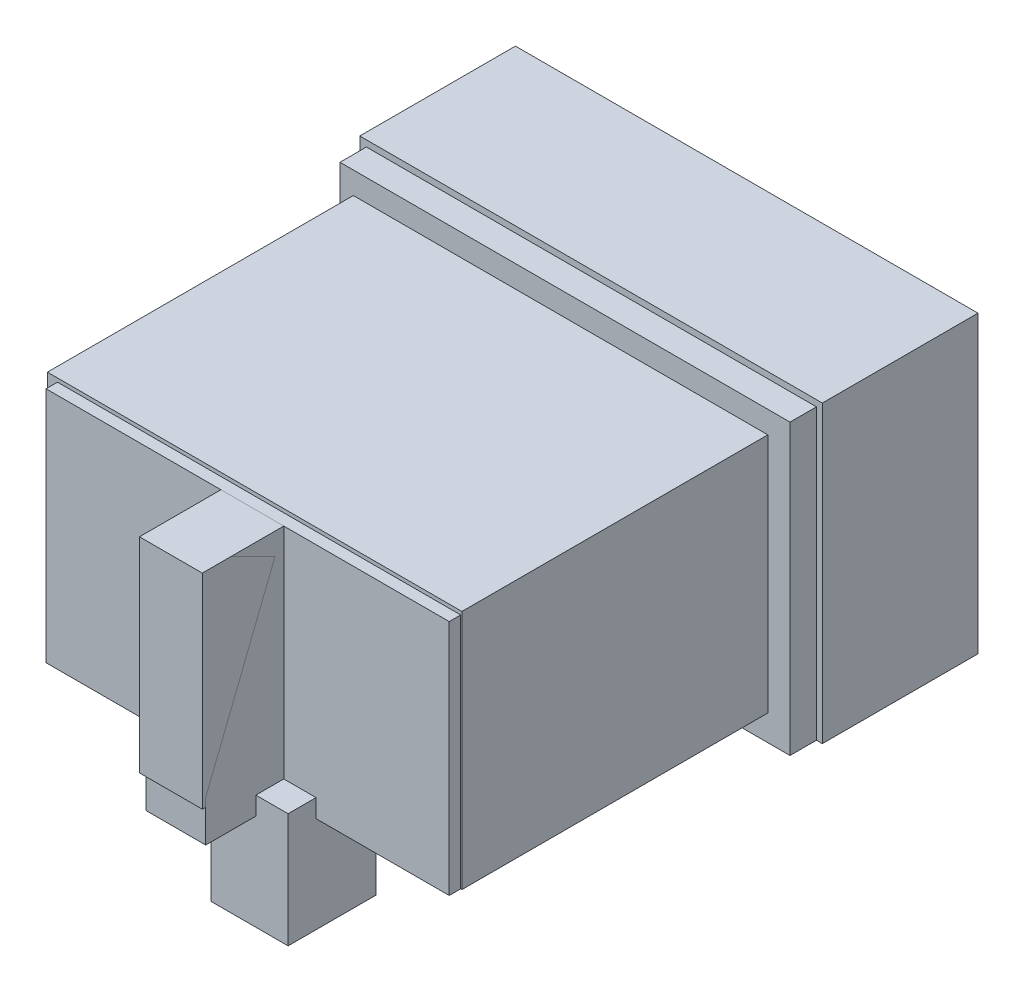
ISO-10303-21;
HEADER;
FILE_DESCRIPTION(('STEP AP214'),'2;1');
FILE_NAME('part.step','',(''),(''),'','','');
FILE_SCHEMA(('AUTOMOTIVE_DESIGN { 1 0 10303 214 1 1 1 1 }'));
ENDSEC;
DATA;
#1=APPLICATION_CONTEXT('core data for automotive mechanical design processes');
#2=APPLICATION_PROTOCOL_DEFINITION('international standard','automotive_design',2000,#1);
#3=PRODUCT_CONTEXT('',#1,'mechanical');
#4=PRODUCT('Part','Part','',(#3));
#5=PRODUCT_RELATED_PRODUCT_CATEGORY('part','',(#4));
#6=PRODUCT_DEFINITION_FORMATION('','',#4);
#7=PRODUCT_DEFINITION_CONTEXT('part definition',#1,'design');
#8=PRODUCT_DEFINITION('design','',#6,#7);
#9=PRODUCT_DEFINITION_SHAPE('','',#8);
#10=(LENGTH_UNIT() NAMED_UNIT(*) SI_UNIT(.MILLI.,.METRE.));
#11=(NAMED_UNIT(*) PLANE_ANGLE_UNIT() SI_UNIT($,.RADIAN.));
#12=(NAMED_UNIT(*) SI_UNIT($,.STERADIAN.) SOLID_ANGLE_UNIT());
#13=UNCERTAINTY_MEASURE_WITH_UNIT(LENGTH_MEASURE(1.E-05),#10,'distance_accuracy_value','');
#14=(GEOMETRIC_REPRESENTATION_CONTEXT(3) GLOBAL_UNCERTAINTY_ASSIGNED_CONTEXT((#13)) GLOBAL_UNIT_ASSIGNED_CONTEXT((#10,
#11,#12)) REPRESENTATION_CONTEXT('',''));
#15=CARTESIAN_POINT('',(0.,0.,0.));
#16=DIRECTION('',(0.,0.,1.));
#17=DIRECTION('',(1.,0.,0.));
#18=AXIS2_PLACEMENT_3D('',#15,#16,#17);
#19=CARTESIAN_POINT('',(69.5,-165.,610.));
#20=DIRECTION('',(1.,0.,0.));
#21=DIRECTION('',(0.,0.,-1.));
#22=AXIS2_PLACEMENT_3D('',#19,#20,#21);
#23=PLANE('',#22);
#24=DIRECTION('',(0.,0.,-1.));
#25=VECTOR('',#24,1.);
#26=CARTESIAN_POINT('',(69.5,228.,610.));
#27=LINE('',#26,#25);
#28=CARTESIAN_POINT('',(69.5,228.,766.583617578014));
#29=VERTEX_POINT('',#28);
#30=CARTESIAN_POINT('',(69.5,228.,610.));
#31=VERTEX_POINT('',#30);
#32=EDGE_CURVE('E118',#29,#31,#27,.T.);
#33=ORIENTED_EDGE('',*,*,#32,.F.);
#34=DIRECTION('',(0.,1.,0.));
#35=VECTOR('',#34,1.);
#36=CARTESIAN_POINT('',(69.5,-165.,766.583617578014));
#37=LINE('',#36,#35);
#38=CARTESIAN_POINT('',(69.5,-165.,766.583617578014));
#39=VERTEX_POINT('',#38);
#40=EDGE_CURVE('E12',#39,#29,#37,.T.);
#41=ORIENTED_EDGE('',*,*,#40,.F.);
#42=DIRECTION('',(0.,0.,-1.));
#43=VECTOR('',#42,1.);
#44=CARTESIAN_POINT('',(69.5,-165.,610.));
#45=LINE('',#44,#43);
#46=CARTESIAN_POINT('',(69.5,-165.,610.));
#47=VERTEX_POINT('',#46);
#48=EDGE_CURVE('E112',#39,#47,#45,.T.);
#49=ORIENTED_EDGE('',*,*,#48,.T.);
#50=DIRECTION('',(0.,1.,0.));
#51=VECTOR('',#50,1.);
#52=CARTESIAN_POINT('',(69.5,-165.,610.));
#53=LINE('',#52,#51);
#54=EDGE_CURVE('E57',#47,#31,#53,.T.);
#55=ORIENTED_EDGE('',*,*,#54,.T.);
#56=EDGE_LOOP('',(#33,#41,#49,#55));
#57=FACE_BOUND('',#56,.T.);
#58=ADVANCED_FACE('F54',(#57),#23,.T.);
#59=CARTESIAN_POINT('',(69.5,-165.,766.583617578014));
#60=DIRECTION('',(0.,0.,1.));
#61=DIRECTION('',(1.,0.,0.));
#62=AXIS2_PLACEMENT_3D('',#59,#60,#61);
#63=PLANE('',#62);
#64=DIRECTION('',(1.,0.,0.));
#65=VECTOR('',#64,1.);
#66=CARTESIAN_POINT('',(69.5,228.,766.583617578014));
#67=LINE('',#66,#65);
#68=CARTESIAN_POINT('',(-51.2870049330303,228.,766.583617578014));
#69=VERTEX_POINT('',#68);
#70=EDGE_CURVE('E114',#69,#29,#67,.T.);
#71=ORIENTED_EDGE('',*,*,#70,.F.);
#72=DIRECTION('',(0.,1.,0.));
#73=VECTOR('',#72,1.);
#74=CARTESIAN_POINT('',(-51.2870049330303,-165.,766.583617578014));
#75=LINE('',#74,#73);
#76=CARTESIAN_POINT('',(-51.2870049330303,-165.,766.583617578014));
#77=VERTEX_POINT('',#76);
#78=EDGE_CURVE('E63',#77,#69,#75,.T.);
#79=ORIENTED_EDGE('',*,*,#78,.F.);
#80=DIRECTION('',(1.,0.,0.));
#81=VECTOR('',#80,1.);
#82=CARTESIAN_POINT('',(69.5,-165.,766.583617578014));
#83=LINE('',#82,#81);
#84=EDGE_CURVE('E109',#77,#39,#83,.T.);
#85=ORIENTED_EDGE('',*,*,#84,.T.);
#86=ORIENTED_EDGE('',*,*,#40,.T.);
#87=EDGE_LOOP('',(#71,#79,#85,#86));
#88=FACE_BOUND('',#87,.T.);
#89=ADVANCED_FACE('F128',(#88),#63,.T.);
#90=CARTESIAN_POINT('',(-51.2870049330303,-165.,610.));
#91=DIRECTION('',(-1.,0.,0.));
#92=DIRECTION('',(0.,0.,1.));
#93=AXIS2_PLACEMENT_3D('',#90,#91,#92);
#94=PLANE('',#93);
#95=DIRECTION('',(0.,0.,1.));
#96=VECTOR('',#95,1.);
#97=CARTESIAN_POINT('',(-51.2870049330303,228.,610.));
#98=LINE('',#97,#96);
#99=CARTESIAN_POINT('',(-51.2870049330303,228.,610.));
#100=VERTEX_POINT('',#99);
#101=EDGE_CURVE('E104',#100,#69,#98,.T.);
#102=ORIENTED_EDGE('',*,*,#101,.F.);
#103=DIRECTION('',(0.,1.,0.));
#104=VECTOR('',#103,1.);
#105=CARTESIAN_POINT('',(-51.2870049330303,-165.,610.));
#106=LINE('',#105,#104);
#107=CARTESIAN_POINT('',(-51.2870049330303,-165.,610.));
#108=VERTEX_POINT('',#107);
#109=EDGE_CURVE('E99',#108,#100,#106,.T.);
#110=ORIENTED_EDGE('',*,*,#109,.F.);
#111=DIRECTION('',(0.,0.,1.));
#112=VECTOR('',#111,1.);
#113=CARTESIAN_POINT('',(-51.2870049330303,-165.,610.));
#114=LINE('',#113,#112);
#115=EDGE_CURVE('E102',#108,#77,#114,.T.);
#116=ORIENTED_EDGE('',*,*,#115,.T.);
#117=ORIENTED_EDGE('',*,*,#78,.T.);
#118=EDGE_LOOP('',(#102,#110,#116,#117));
#119=FACE_BOUND('',#118,.T.);
#120=ADVANCED_FACE('F101',(#119),#94,.T.);
#121=CARTESIAN_POINT('',(69.5,-165.,610.));
#122=DIRECTION('',(0.,0.,-1.));
#123=DIRECTION('',(-1.,0.,0.));
#124=AXIS2_PLACEMENT_3D('',#121,#122,#123);
#125=PLANE('',#124);
#126=DIRECTION('',(-1.,0.,0.));
#127=VECTOR('',#126,1.);
#128=CARTESIAN_POINT('',(69.5,228.,610.));
#129=LINE('',#128,#127);
#130=EDGE_CURVE('E121',#31,#100,#129,.T.);
#131=ORIENTED_EDGE('',*,*,#130,.F.);
#132=ORIENTED_EDGE('',*,*,#54,.F.);
#133=DIRECTION('',(-1.,0.,0.));
#134=VECTOR('',#133,1.);
#135=CARTESIAN_POINT('',(69.5,-165.,610.));
#136=LINE('',#135,#134);
#137=EDGE_CURVE('E108',#47,#108,#136,.T.);
#138=ORIENTED_EDGE('',*,*,#137,.T.);
#139=ORIENTED_EDGE('',*,*,#109,.T.);
#140=EDGE_LOOP('',(#131,#132,#138,#139));
#141=FACE_BOUND('',#140,.T.);
#142=ADVANCED_FACE('F111',(#141),#125,.T.);
#143=CARTESIAN_POINT('',(0.,-165.,0.));
#144=DIRECTION('',(0.,-1.,0.));
#145=DIRECTION('',(0.,0.,-1.));
#146=AXIS2_PLACEMENT_3D('',#143,#144,#145);
#147=PLANE('',#146);
#148=ORIENTED_EDGE('',*,*,#48,.F.);
#149=ORIENTED_EDGE('',*,*,#84,.F.);
#150=ORIENTED_EDGE('',*,*,#115,.F.);
#151=ORIENTED_EDGE('',*,*,#137,.F.);
#152=EDGE_LOOP('',(#148,#149,#150,#151));
#153=FACE_BOUND('',#152,.T.);
#154=ADVANCED_FACE('F107',(#153),#147,.T.);
#155=CARTESIAN_POINT('',(0.,228.,0.));
#156=DIRECTION('',(0.,-1.,0.));
#157=DIRECTION('',(0.,0.,-1.));
#158=AXIS2_PLACEMENT_3D('',#155,#156,#157);
#159=PLANE('',#158);
#160=ORIENTED_EDGE('',*,*,#32,.T.);
#161=ORIENTED_EDGE('',*,*,#130,.T.);
#162=ORIENTED_EDGE('',*,*,#101,.T.);
#163=ORIENTED_EDGE('',*,*,#70,.T.);
#164=EDGE_LOOP('',(#160,#161,#162,#163));
#165=FACE_BOUND('',#164,.T.);
#166=ADVANCED_FACE('F127',(#165),#159,.F.);
#167=CLOSED_SHELL('',(#58,#89,#120,#142,#154,#166));
#168=MANIFOLD_SOLID_BREP('B2',#167);
#169=CARTESIAN_POINT('',(-16.6350652606155,-193.,495.));
#170=DIRECTION('',(-1.,0.,0.));
#171=DIRECTION('',(0.,0.,1.));
#172=AXIS2_PLACEMENT_3D('',#169,#170,#171);
#173=PLANE('',#172);
#174=DIRECTION('',(0.,0.,-1.));
#175=VECTOR('',#174,1.);
#176=CARTESIAN_POINT('',(-16.6350652606155,-413.,495.));
#177=LINE('',#176,#175);
#178=CARTESIAN_POINT('',(-16.6350652606156,-413.,663.706943007384));
#179=VERTEX_POINT('',#178);
#180=CARTESIAN_POINT('',(-16.6350652606155,-413.,495.));
#181=VERTEX_POINT('',#180);
#182=EDGE_CURVE('E252',#179,#181,#177,.T.);
#183=ORIENTED_EDGE('',*,*,#182,.F.);
#184=DIRECTION('',(0.,-1.,0.));
#185=VECTOR('',#184,1.);
#186=CARTESIAN_POINT('',(-16.6350652606156,-193.,663.706943007384));
#187=LINE('',#186,#185);
#188=CARTESIAN_POINT('',(-16.6350652606156,-193.,663.706943007384));
#189=VERTEX_POINT('',#188);
#190=EDGE_CURVE('E52',#189,#179,#187,.T.);
#191=ORIENTED_EDGE('',*,*,#190,.F.);
#192=DIRECTION('',(0.,0.,-1.));
#193=VECTOR('',#192,1.);
#194=CARTESIAN_POINT('',(-16.6350652606155,-193.,495.));
#195=LINE('',#194,#193);
#196=CARTESIAN_POINT('',(-16.6350652606155,-193.,495.));
#197=VERTEX_POINT('',#196);
#198=EDGE_CURVE('E246',#189,#197,#195,.T.);
#199=ORIENTED_EDGE('',*,*,#198,.T.);
#200=DIRECTION('',(0.,-1.,0.));
#201=VECTOR('',#200,1.);
#202=CARTESIAN_POINT('',(-16.6350652606155,-193.,495.));
#203=LINE('',#202,#201);
#204=EDGE_CURVE('E191',#197,#181,#203,.T.);
#205=ORIENTED_EDGE('',*,*,#204,.T.);
#206=EDGE_LOOP('',(#183,#191,#199,#205));
#207=FACE_BOUND('',#206,.T.);
#208=ADVANCED_FACE('F188',(#207),#173,.T.);
#209=CARTESIAN_POINT('',(-16.6350652606156,-193.,663.706943007384));
#210=DIRECTION('',(0.,0.,1.));
#211=DIRECTION('',(1.,0.,0.));
#212=AXIS2_PLACEMENT_3D('',#209,#210,#211);
#213=PLANE('',#212);
#214=DIRECTION('',(-1.,0.,0.));
#215=VECTOR('',#214,1.);
#216=CARTESIAN_POINT('',(-16.6350652606156,-413.,663.706943007384));
#217=LINE('',#216,#215);
#218=CARTESIAN_POINT('',(131.504781480729,-413.,663.706943007384));
#219=VERTEX_POINT('',#218);
#220=EDGE_CURVE('E248',#219,#179,#217,.T.);
#221=ORIENTED_EDGE('',*,*,#220,.F.);
#222=DIRECTION('',(0.,-1.,0.));
#223=VECTOR('',#222,1.);
#224=CARTESIAN_POINT('',(131.504781480729,-193.,663.706943007384));
#225=LINE('',#224,#223);
#226=CARTESIAN_POINT('',(131.504781480729,-193.,663.706943007384));
#227=VERTEX_POINT('',#226);
#228=EDGE_CURVE('E197',#227,#219,#225,.T.);
#229=ORIENTED_EDGE('',*,*,#228,.F.);
#230=DIRECTION('',(-1.,0.,0.));
#231=VECTOR('',#230,1.);
#232=CARTESIAN_POINT('',(-16.6350652606156,-193.,663.706943007384));
#233=LINE('',#232,#231);
#234=EDGE_CURVE('E243',#227,#189,#233,.T.);
#235=ORIENTED_EDGE('',*,*,#234,.T.);
#236=ORIENTED_EDGE('',*,*,#190,.T.);
#237=EDGE_LOOP('',(#221,#229,#235,#236));
#238=FACE_BOUND('',#237,.T.);
#239=ADVANCED_FACE('F262',(#238),#213,.T.);
#240=CARTESIAN_POINT('',(131.504781480729,-193.,495.));
#241=DIRECTION('',(1.,0.,0.));
#242=DIRECTION('',(0.,0.,-1.));
#243=AXIS2_PLACEMENT_3D('',#240,#241,#242);
#244=PLANE('',#243);
#245=DIRECTION('',(0.,0.,1.));
#246=VECTOR('',#245,1.);
#247=CARTESIAN_POINT('',(131.504781480729,-413.,495.));
#248=LINE('',#247,#246);
#249=CARTESIAN_POINT('',(131.504781480729,-413.,495.));
#250=VERTEX_POINT('',#249);
#251=EDGE_CURVE('E238',#250,#219,#248,.T.);
#252=ORIENTED_EDGE('',*,*,#251,.F.);
#253=DIRECTION('',(0.,-1.,0.));
#254=VECTOR('',#253,1.);
#255=CARTESIAN_POINT('',(131.504781480729,-193.,495.));
#256=LINE('',#255,#254);
#257=CARTESIAN_POINT('',(131.504781480729,-193.,495.));
#258=VERTEX_POINT('',#257);
#259=EDGE_CURVE('E233',#258,#250,#256,.T.);
#260=ORIENTED_EDGE('',*,*,#259,.F.);
#261=DIRECTION('',(0.,0.,1.));
#262=VECTOR('',#261,1.);
#263=CARTESIAN_POINT('',(131.504781480729,-193.,495.));
#264=LINE('',#263,#262);
#265=EDGE_CURVE('E236',#258,#227,#264,.T.);
#266=ORIENTED_EDGE('',*,*,#265,.T.);
#267=ORIENTED_EDGE('',*,*,#228,.T.);
#268=EDGE_LOOP('',(#252,#260,#266,#267));
#269=FACE_BOUND('',#268,.T.);
#270=ADVANCED_FACE('F235',(#269),#244,.T.);
#271=CARTESIAN_POINT('',(-16.6350652606155,-193.,495.));
#272=DIRECTION('',(0.,0.,-1.));
#273=DIRECTION('',(-1.,0.,0.));
#274=AXIS2_PLACEMENT_3D('',#271,#272,#273);
#275=PLANE('',#274);
#276=DIRECTION('',(1.,0.,0.));
#277=VECTOR('',#276,1.);
#278=CARTESIAN_POINT('',(-16.6350652606155,-413.,495.));
#279=LINE('',#278,#277);
#280=EDGE_CURVE('E255',#181,#250,#279,.T.);
#281=ORIENTED_EDGE('',*,*,#280,.F.);
#282=ORIENTED_EDGE('',*,*,#204,.F.);
#283=DIRECTION('',(1.,0.,0.));
#284=VECTOR('',#283,1.);
#285=CARTESIAN_POINT('',(-16.6350652606155,-193.,495.));
#286=LINE('',#285,#284);
#287=EDGE_CURVE('E242',#197,#258,#286,.T.);
#288=ORIENTED_EDGE('',*,*,#287,.T.);
#289=ORIENTED_EDGE('',*,*,#259,.T.);
#290=EDGE_LOOP('',(#281,#282,#288,#289));
#291=FACE_BOUND('',#290,.T.);
#292=ADVANCED_FACE('F245',(#291),#275,.T.);
#293=CARTESIAN_POINT('',(0.,-193.,0.));
#294=DIRECTION('',(0.,1.,0.));
#295=DIRECTION('',(0.,0.,1.));
#296=AXIS2_PLACEMENT_3D('',#293,#294,#295);
#297=PLANE('',#296);
#298=ORIENTED_EDGE('',*,*,#198,.F.);
#299=ORIENTED_EDGE('',*,*,#234,.F.);
#300=ORIENTED_EDGE('',*,*,#265,.F.);
#301=ORIENTED_EDGE('',*,*,#287,.F.);
#302=EDGE_LOOP('',(#298,#299,#300,#301));
#303=FACE_BOUND('',#302,.T.);
#304=ADVANCED_FACE('F241',(#303),#297,.T.);
#305=CARTESIAN_POINT('',(0.,-413.,0.));
#306=DIRECTION('',(0.,1.,0.));
#307=DIRECTION('',(0.,0.,1.));
#308=AXIS2_PLACEMENT_3D('',#305,#306,#307);
#309=PLANE('',#308);
#310=ORIENTED_EDGE('',*,*,#182,.T.);
#311=ORIENTED_EDGE('',*,*,#280,.T.);
#312=ORIENTED_EDGE('',*,*,#251,.T.);
#313=ORIENTED_EDGE('',*,*,#220,.T.);
#314=EDGE_LOOP('',(#310,#311,#312,#313));
#315=FACE_BOUND('',#314,.T.);
#316=ADVANCED_FACE('F261',(#315),#309,.F.);
#317=CLOSED_SHELL('',(#208,#239,#270,#292,#304,#316));
#318=MANIFOLD_SOLID_BREP('B6',#317);
#319=CARTESIAN_POINT('',(-406.83472648578,235.,0.));
#320=DIRECTION('',(-1.,0.,0.));
#321=DIRECTION('',(0.,0.,1.));
#322=AXIS2_PLACEMENT_3D('',#319,#320,#321);
#323=PLANE('',#322);
#324=DIRECTION('',(0.,0.,-1.));
#325=VECTOR('',#324,1.);
#326=CARTESIAN_POINT('',(-406.83472648578,-228.,0.));
#327=LINE('',#326,#325);
#328=CARTESIAN_POINT('',(-406.83472648578,-228.,587.968632112918));
#329=VERTEX_POINT('',#328);
#330=CARTESIAN_POINT('',(-406.83472648578,-228.,0.));
#331=VERTEX_POINT('',#330);
#332=EDGE_CURVE('E386',#329,#331,#327,.T.);
#333=ORIENTED_EDGE('',*,*,#332,.F.);
#334=DIRECTION('',(0.,-1.,0.));
#335=VECTOR('',#334,1.);
#336=CARTESIAN_POINT('',(-406.83472648578,235.,587.968632112918));
#337=LINE('',#336,#335);
#338=CARTESIAN_POINT('',(-406.83472648578,235.,587.968632112918));
#339=VERTEX_POINT('',#338);
#340=EDGE_CURVE('E186',#339,#329,#337,.T.);
#341=ORIENTED_EDGE('',*,*,#340,.F.);
#342=DIRECTION('',(0.,0.,-1.));
#343=VECTOR('',#342,1.);
#344=CARTESIAN_POINT('',(-406.83472648578,235.,0.));
#345=LINE('',#344,#343);
#346=CARTESIAN_POINT('',(-406.83472648578,235.,0.));
#347=VERTEX_POINT('',#346);
#348=EDGE_CURVE('E380',#339,#347,#345,.T.);
#349=ORIENTED_EDGE('',*,*,#348,.T.);
#350=DIRECTION('',(0.,-1.,0.));
#351=VECTOR('',#350,1.);
#352=CARTESIAN_POINT('',(-406.83472648578,235.,0.));
#353=LINE('',#352,#351);
#354=EDGE_CURVE('E325',#347,#331,#353,.T.);
#355=ORIENTED_EDGE('',*,*,#354,.T.);
#356=EDGE_LOOP('',(#333,#341,#349,#355));
#357=FACE_BOUND('',#356,.T.);
#358=ADVANCED_FACE('F322',(#357),#323,.T.);
#359=CARTESIAN_POINT('',(-406.83472648578,235.,587.968632112918));
#360=DIRECTION('',(0.,0.,1.));
#361=DIRECTION('',(1.,0.,0.));
#362=AXIS2_PLACEMENT_3D('',#359,#360,#361);
#363=PLANE('',#362);
#364=DIRECTION('',(-1.,0.,0.));
#365=VECTOR('',#364,1.);
#366=CARTESIAN_POINT('',(-406.83472648578,-228.,587.968632112918));
#367=LINE('',#366,#365);
#368=CARTESIAN_POINT('',(389.846176817684,-228.,587.968632112918));
#369=VERTEX_POINT('',#368);
#370=EDGE_CURVE('E382',#369,#329,#367,.T.);
#371=ORIENTED_EDGE('',*,*,#370,.F.);
#372=DIRECTION('',(0.,-1.,0.));
#373=VECTOR('',#372,1.);
#374=CARTESIAN_POINT('',(389.846176817684,235.,587.968632112918));
#375=LINE('',#374,#373);
#376=CARTESIAN_POINT('',(389.846176817684,235.,587.968632112918));
#377=VERTEX_POINT('',#376);
#378=EDGE_CURVE('E331',#377,#369,#375,.T.);
#379=ORIENTED_EDGE('',*,*,#378,.F.);
#380=DIRECTION('',(-1.,0.,0.));
#381=VECTOR('',#380,1.);
#382=CARTESIAN_POINT('',(-406.83472648578,235.,587.968632112918));
#383=LINE('',#382,#381);
#384=EDGE_CURVE('E377',#377,#339,#383,.T.);
#385=ORIENTED_EDGE('',*,*,#384,.T.);
#386=ORIENTED_EDGE('',*,*,#340,.T.);
#387=EDGE_LOOP('',(#371,#379,#385,#386));
#388=FACE_BOUND('',#387,.T.);
#389=ADVANCED_FACE('F396',(#388),#363,.T.);
#390=CARTESIAN_POINT('',(389.846176817684,235.,0.));
#391=DIRECTION('',(1.,0.,0.));
#392=DIRECTION('',(0.,0.,-1.));
#393=AXIS2_PLACEMENT_3D('',#390,#391,#392);
#394=PLANE('',#393);
#395=DIRECTION('',(0.,0.,1.));
#396=VECTOR('',#395,1.);
#397=CARTESIAN_POINT('',(389.846176817684,-228.,0.));
#398=LINE('',#397,#396);
#399=CARTESIAN_POINT('',(389.846176817684,-228.,0.));
#400=VERTEX_POINT('',#399);
#401=EDGE_CURVE('E372',#400,#369,#398,.T.);
#402=ORIENTED_EDGE('',*,*,#401,.F.);
#403=DIRECTION('',(0.,-1.,0.));
#404=VECTOR('',#403,1.);
#405=CARTESIAN_POINT('',(389.846176817684,235.,0.));
#406=LINE('',#405,#404);
#407=CARTESIAN_POINT('',(389.846176817684,235.,0.));
#408=VERTEX_POINT('',#407);
#409=EDGE_CURVE('E367',#408,#400,#406,.T.);
#410=ORIENTED_EDGE('',*,*,#409,.F.);
#411=DIRECTION('',(0.,0.,1.));
#412=VECTOR('',#411,1.);
#413=CARTESIAN_POINT('',(389.846176817684,235.,0.));
#414=LINE('',#413,#412);
#415=EDGE_CURVE('E370',#408,#377,#414,.T.);
#416=ORIENTED_EDGE('',*,*,#415,.T.);
#417=ORIENTED_EDGE('',*,*,#378,.T.);
#418=EDGE_LOOP('',(#402,#410,#416,#417));
#419=FACE_BOUND('',#418,.T.);
#420=ADVANCED_FACE('F369',(#419),#394,.T.);
#421=CARTESIAN_POINT('',(-406.83472648578,235.,0.));
#422=DIRECTION('',(0.,0.,-1.));
#423=DIRECTION('',(-1.,0.,0.));
#424=AXIS2_PLACEMENT_3D('',#421,#422,#423);
#425=PLANE('',#424);
#426=DIRECTION('',(1.,0.,0.));
#427=VECTOR('',#426,1.);
#428=CARTESIAN_POINT('',(-406.83472648578,-228.,0.));
#429=LINE('',#428,#427);
#430=EDGE_CURVE('E389',#331,#400,#429,.T.);
#431=ORIENTED_EDGE('',*,*,#430,.F.);
#432=ORIENTED_EDGE('',*,*,#354,.F.);
#433=DIRECTION('',(1.,0.,0.));
#434=VECTOR('',#433,1.);
#435=CARTESIAN_POINT('',(-406.83472648578,235.,0.));
#436=LINE('',#435,#434);
#437=EDGE_CURVE('E376',#347,#408,#436,.T.);
#438=ORIENTED_EDGE('',*,*,#437,.T.);
#439=ORIENTED_EDGE('',*,*,#409,.T.);
#440=EDGE_LOOP('',(#431,#432,#438,#439));
#441=FACE_BOUND('',#440,.T.);
#442=ADVANCED_FACE('F379',(#441),#425,.T.);
#443=CARTESIAN_POINT('',(0.,235.,0.));
#444=DIRECTION('',(0.,1.,0.));
#445=DIRECTION('',(0.,0.,1.));
#446=AXIS2_PLACEMENT_3D('',#443,#444,#445);
#447=PLANE('',#446);
#448=ORIENTED_EDGE('',*,*,#348,.F.);
#449=ORIENTED_EDGE('',*,*,#384,.F.);
#450=ORIENTED_EDGE('',*,*,#415,.F.);
#451=ORIENTED_EDGE('',*,*,#437,.F.);
#452=EDGE_LOOP('',(#448,#449,#450,#451));
#453=FACE_BOUND('',#452,.T.);
#454=ADVANCED_FACE('F375',(#453),#447,.T.);
#455=CARTESIAN_POINT('',(0.,-228.,0.));
#456=DIRECTION('',(0.,1.,0.));
#457=DIRECTION('',(0.,0.,1.));
#458=AXIS2_PLACEMENT_3D('',#455,#456,#457);
#459=PLANE('',#458);
#460=ORIENTED_EDGE('',*,*,#332,.T.);
#461=ORIENTED_EDGE('',*,*,#430,.T.);
#462=ORIENTED_EDGE('',*,*,#401,.T.);
#463=ORIENTED_EDGE('',*,*,#370,.T.);
#464=EDGE_LOOP('',(#460,#461,#462,#463));
#465=FACE_BOUND('',#464,.T.);
#466=ADVANCED_FACE('F395',(#465),#459,.F.);
#467=CLOSED_SHELL('',(#358,#389,#420,#442,#454,#466));
#468=MANIFOLD_SOLID_BREP('B46',#467);
#469=CARTESIAN_POINT('',(-445.213159305389,289.5,-50.8032885490837));
#470=DIRECTION('',(-1.,0.,0.));
#471=DIRECTION('',(0.,0.,1.));
#472=AXIS2_PLACEMENT_3D('',#469,#470,#471);
#473=PLANE('',#472);
#474=DIRECTION('',(0.,0.,-1.));
#475=VECTOR('',#474,1.);
#476=CARTESIAN_POINT('',(-445.213159305389,-277.5,-50.8032885490837));
#477=LINE('',#476,#475);
#478=CARTESIAN_POINT('',(-445.213159305389,-277.5,-50.8032885490837));
#479=VERTEX_POINT('',#478);
#480=CARTESIAN_POINT('',(-445.213159305389,-277.5,-350.));
#481=VERTEX_POINT('',#480);
#482=EDGE_CURVE('E520',#479,#481,#477,.T.);
#483=ORIENTED_EDGE('',*,*,#482,.F.);
#484=DIRECTION('',(0.,-1.,0.));
#485=VECTOR('',#484,1.);
#486=CARTESIAN_POINT('',(-445.213159305389,289.5,-50.8032885490837));
#487=LINE('',#486,#485);
#488=CARTESIAN_POINT('',(-445.213159305389,289.5,-50.8032885490837));
#489=VERTEX_POINT('',#488);
#490=EDGE_CURVE('E320',#489,#479,#487,.T.);
#491=ORIENTED_EDGE('',*,*,#490,.F.);
#492=DIRECTION('',(0.,0.,-1.));
#493=VECTOR('',#492,1.);
#494=CARTESIAN_POINT('',(-445.213159305389,289.5,-50.8032885490837));
#495=LINE('',#494,#493);
#496=CARTESIAN_POINT('',(-445.213159305389,289.5,-350.));
#497=VERTEX_POINT('',#496);
#498=EDGE_CURVE('E514',#489,#497,#495,.T.);
#499=ORIENTED_EDGE('',*,*,#498,.T.);
#500=DIRECTION('',(0.,-1.,0.));
#501=VECTOR('',#500,1.);
#502=CARTESIAN_POINT('',(-445.213159305389,289.5,-350.));
#503=LINE('',#502,#501);
#504=EDGE_CURVE('E459',#497,#481,#503,.T.);
#505=ORIENTED_EDGE('',*,*,#504,.T.);
#506=EDGE_LOOP('',(#483,#491,#499,#505));
#507=FACE_BOUND('',#506,.T.);
#508=ADVANCED_FACE('F456',(#507),#473,.T.);
#509=CARTESIAN_POINT('',(-445.213159305389,289.5,-50.8032885490837));
#510=DIRECTION('',(0.,0.,1.));
#511=DIRECTION('',(1.,0.,0.));
#512=AXIS2_PLACEMENT_3D('',#509,#510,#511);
#513=PLANE('',#512);
#514=DIRECTION('',(-1.,0.,0.));
#515=VECTOR('',#514,1.);
#516=CARTESIAN_POINT('',(-445.213159305389,-277.5,-50.8032885490837));
#517=LINE('',#516,#515);
#518=CARTESIAN_POINT('',(443.807495859979,-277.5,-50.8032885490836));
#519=VERTEX_POINT('',#518);
#520=EDGE_CURVE('E516',#519,#479,#517,.T.);
#521=ORIENTED_EDGE('',*,*,#520,.F.);
#522=DIRECTION('',(0.,-1.,0.));
#523=VECTOR('',#522,1.);
#524=CARTESIAN_POINT('',(443.807495859979,289.5,-50.8032885490836));
#525=LINE('',#524,#523);
#526=CARTESIAN_POINT('',(443.807495859979,289.5,-50.8032885490836));
#527=VERTEX_POINT('',#526);
#528=EDGE_CURVE('E465',#527,#519,#525,.T.);
#529=ORIENTED_EDGE('',*,*,#528,.F.);
#530=DIRECTION('',(-1.,0.,0.));
#531=VECTOR('',#530,1.);
#532=CARTESIAN_POINT('',(-445.213159305389,289.5,-50.8032885490837));
#533=LINE('',#532,#531);
#534=EDGE_CURVE('E511',#527,#489,#533,.T.);
#535=ORIENTED_EDGE('',*,*,#534,.T.);
#536=ORIENTED_EDGE('',*,*,#490,.T.);
#537=EDGE_LOOP('',(#521,#529,#535,#536));
#538=FACE_BOUND('',#537,.T.);
#539=ADVANCED_FACE('F530',(#538),#513,.T.);
#540=CARTESIAN_POINT('',(443.807495859979,289.5,-50.8032885490836));
#541=DIRECTION('',(1.,0.,0.));
#542=DIRECTION('',(0.,0.,-1.));
#543=AXIS2_PLACEMENT_3D('',#540,#541,#542);
#544=PLANE('',#543);
#545=DIRECTION('',(0.,0.,1.));
#546=VECTOR('',#545,1.);
#547=CARTESIAN_POINT('',(443.807495859979,-277.5,-50.8032885490836));
#548=LINE('',#547,#546);
#549=CARTESIAN_POINT('',(443.807495859979,-277.5,-350.));
#550=VERTEX_POINT('',#549);
#551=EDGE_CURVE('E506',#550,#519,#548,.T.);
#552=ORIENTED_EDGE('',*,*,#551,.F.);
#553=DIRECTION('',(0.,-1.,0.));
#554=VECTOR('',#553,1.);
#555=CARTESIAN_POINT('',(443.807495859979,289.5,-350.));
#556=LINE('',#555,#554);
#557=CARTESIAN_POINT('',(443.807495859979,289.5,-350.));
#558=VERTEX_POINT('',#557);
#559=EDGE_CURVE('E501',#558,#550,#556,.T.);
#560=ORIENTED_EDGE('',*,*,#559,.F.);
#561=DIRECTION('',(0.,0.,1.));
#562=VECTOR('',#561,1.);
#563=CARTESIAN_POINT('',(443.807495859979,289.5,-50.8032885490836));
#564=LINE('',#563,#562);
#565=EDGE_CURVE('E504',#558,#527,#564,.T.);
#566=ORIENTED_EDGE('',*,*,#565,.T.);
#567=ORIENTED_EDGE('',*,*,#528,.T.);
#568=EDGE_LOOP('',(#552,#560,#566,#567));
#569=FACE_BOUND('',#568,.T.);
#570=ADVANCED_FACE('F503',(#569),#544,.T.);
#571=CARTESIAN_POINT('',(-445.213159305389,289.5,-350.));
#572=DIRECTION('',(0.,0.,-1.));
#573=DIRECTION('',(-1.,0.,0.));
#574=AXIS2_PLACEMENT_3D('',#571,#572,#573);
#575=PLANE('',#574);
#576=DIRECTION('',(1.,0.,0.));
#577=VECTOR('',#576,1.);
#578=CARTESIAN_POINT('',(-445.213159305389,-277.5,-350.));
#579=LINE('',#578,#577);
#580=EDGE_CURVE('E523',#481,#550,#579,.T.);
#581=ORIENTED_EDGE('',*,*,#580,.F.);
#582=ORIENTED_EDGE('',*,*,#504,.F.);
#583=DIRECTION('',(1.,0.,0.));
#584=VECTOR('',#583,1.);
#585=CARTESIAN_POINT('',(-445.213159305389,289.5,-350.));
#586=LINE('',#585,#584);
#587=EDGE_CURVE('E510',#497,#558,#586,.T.);
#588=ORIENTED_EDGE('',*,*,#587,.T.);
#589=ORIENTED_EDGE('',*,*,#559,.T.);
#590=EDGE_LOOP('',(#581,#582,#588,#589));
#591=FACE_BOUND('',#590,.T.);
#592=ADVANCED_FACE('F513',(#591),#575,.T.);
#593=CARTESIAN_POINT('',(0.,289.5,0.));
#594=DIRECTION('',(0.,-1.,0.));
#595=DIRECTION('',(0.,0.,-1.));
#596=AXIS2_PLACEMENT_3D('',#593,#594,#595);
#597=PLANE('',#596);
#598=ORIENTED_EDGE('',*,*,#498,.F.);
#599=ORIENTED_EDGE('',*,*,#534,.F.);
#600=ORIENTED_EDGE('',*,*,#565,.F.);
#601=ORIENTED_EDGE('',*,*,#587,.F.);
#602=EDGE_LOOP('',(#598,#599,#600,#601));
#603=FACE_BOUND('',#602,.T.);
#604=ADVANCED_FACE('F509',(#603),#597,.F.);
#605=CARTESIAN_POINT('',(0.,-277.5,0.));
#606=DIRECTION('',(0.,-1.,0.));
#607=DIRECTION('',(0.,0.,-1.));
#608=AXIS2_PLACEMENT_3D('',#605,#606,#607);
#609=PLANE('',#608);
#610=ORIENTED_EDGE('',*,*,#482,.T.);
#611=ORIENTED_EDGE('',*,*,#580,.T.);
#612=ORIENTED_EDGE('',*,*,#551,.T.);
#613=ORIENTED_EDGE('',*,*,#520,.T.);
#614=EDGE_LOOP('',(#610,#611,#612,#613));
#615=FACE_BOUND('',#614,.T.);
#616=ADVANCED_FACE('F529',(#615),#609,.T.);
#617=CLOSED_SHELL('',(#508,#539,#570,#592,#604,#616));
#618=MANIFOLD_SOLID_BREP('B180',#617);
#619=CARTESIAN_POINT('',(127.5,-198.,660.));
#620=DIRECTION('',(1.,0.,0.));
#621=DIRECTION('',(0.,0.,-1.));
#622=AXIS2_PLACEMENT_3D('',#619,#620,#621);
#623=PLANE('',#622);
#624=DIRECTION('',(0.,-1.,0.));
#625=VECTOR('',#624,1.);
#626=CARTESIAN_POINT('',(127.5,-198.,660.));
#627=LINE('',#626,#625);
#628=CARTESIAN_POINT('',(127.5,-198.,660.));
#629=VERTEX_POINT('',#628);
#630=CARTESIAN_POINT('',(127.5,-413.,660.));
#631=VERTEX_POINT('',#630);
#632=EDGE_CURVE('E593',#629,#631,#627,.T.);
#633=ORIENTED_EDGE('',*,*,#632,.T.);
#634=DIRECTION('',(0.,0.,1.));
#635=VECTOR('',#634,1.);
#636=CARTESIAN_POINT('',(127.5,-413.,660.));
#637=LINE('',#636,#635);
#638=CARTESIAN_POINT('',(127.5,-413.,495.));
#639=VERTEX_POINT('',#638);
#640=EDGE_CURVE('E630',#639,#631,#637,.T.);
#641=ORIENTED_EDGE('',*,*,#640,.F.);
#642=DIRECTION('',(0.,-1.,0.));
#643=VECTOR('',#642,1.);
#644=CARTESIAN_POINT('',(127.5,-198.,495.));
#645=LINE('',#644,#643);
#646=CARTESIAN_POINT('',(127.5,-198.,495.));
#647=VERTEX_POINT('',#646);
#648=EDGE_CURVE('E454',#647,#639,#645,.T.);
#649=ORIENTED_EDGE('',*,*,#648,.F.);
#650=DIRECTION('',(0.,0.,1.));
#651=VECTOR('',#650,1.);
#652=CARTESIAN_POINT('',(127.5,-198.,660.));
#653=LINE('',#652,#651);
#654=EDGE_CURVE('E631',#647,#629,#653,.T.);
#655=ORIENTED_EDGE('',*,*,#654,.T.);
#656=EDGE_LOOP('',(#633,#641,#649,#655));
#657=FACE_BOUND('',#656,.T.);
#658=ADVANCED_FACE('F590',(#657),#623,.T.);
#659=CARTESIAN_POINT('',(-12.5,-198.,495.));
#660=DIRECTION('',(0.,0.,-1.));
#661=DIRECTION('',(-1.,0.,0.));
#662=AXIS2_PLACEMENT_3D('',#659,#660,#661);
#663=PLANE('',#662);
#664=ORIENTED_EDGE('',*,*,#648,.T.);
#665=DIRECTION('',(1.,0.,0.));
#666=VECTOR('',#665,1.);
#667=CARTESIAN_POINT('',(-12.5,-413.,495.));
#668=LINE('',#667,#666);
#669=CARTESIAN_POINT('',(-12.5,-413.,495.));
#670=VERTEX_POINT('',#669);
#671=EDGE_CURVE('E647',#670,#639,#668,.T.);
#672=ORIENTED_EDGE('',*,*,#671,.F.);
#673=DIRECTION('',(0.,-1.,0.));
#674=VECTOR('',#673,1.);
#675=CARTESIAN_POINT('',(-12.5,-198.,495.));
#676=LINE('',#675,#674);
#677=CARTESIAN_POINT('',(-12.5,-198.,495.));
#678=VERTEX_POINT('',#677);
#679=EDGE_CURVE('E598',#678,#670,#676,.T.);
#680=ORIENTED_EDGE('',*,*,#679,.F.);
#681=DIRECTION('',(1.,0.,0.));
#682=VECTOR('',#681,1.);
#683=CARTESIAN_POINT('',(-12.5,-198.,495.));
#684=LINE('',#683,#682);
#685=EDGE_CURVE('E636',#678,#647,#684,.T.);
#686=ORIENTED_EDGE('',*,*,#685,.T.);
#687=EDGE_LOOP('',(#664,#672,#680,#686));
#688=FACE_BOUND('',#687,.T.);
#689=ADVANCED_FACE('F662',(#688),#663,.T.);
#690=CARTESIAN_POINT('',(-12.5,-198.,660.));
#691=DIRECTION('',(-1.,0.,0.));
#692=DIRECTION('',(0.,0.,1.));
#693=AXIS2_PLACEMENT_3D('',#690,#691,#692);
#694=PLANE('',#693);
#695=ORIENTED_EDGE('',*,*,#679,.T.);
#696=DIRECTION('',(0.,0.,-1.));
#697=VECTOR('',#696,1.);
#698=CARTESIAN_POINT('',(-12.5,-413.,660.));
#699=LINE('',#698,#697);
#700=CARTESIAN_POINT('',(-12.5,-413.,660.));
#701=VERTEX_POINT('',#700);
#702=EDGE_CURVE('E643',#701,#670,#699,.T.);
#703=ORIENTED_EDGE('',*,*,#702,.F.);
#704=DIRECTION('',(0.,-1.,0.));
#705=VECTOR('',#704,1.);
#706=CARTESIAN_POINT('',(-12.5,-198.,660.));
#707=LINE('',#706,#705);
#708=CARTESIAN_POINT('',(-12.5,-198.,660.));
#709=VERTEX_POINT('',#708);
#710=EDGE_CURVE('E635',#709,#701,#707,.T.);
#711=ORIENTED_EDGE('',*,*,#710,.F.);
#712=DIRECTION('',(0.,0.,-1.));
#713=VECTOR('',#712,1.);
#714=CARTESIAN_POINT('',(-12.5,-198.,660.));
#715=LINE('',#714,#713);
#716=EDGE_CURVE('E655',#709,#678,#715,.T.);
#717=ORIENTED_EDGE('',*,*,#716,.T.);
#718=EDGE_LOOP('',(#695,#703,#711,#717));
#719=FACE_BOUND('',#718,.T.);
#720=ADVANCED_FACE('F659',(#719),#694,.T.);
#721=CARTESIAN_POINT('',(-12.5,-198.,660.));
#722=DIRECTION('',(0.,0.,1.));
#723=DIRECTION('',(1.,0.,0.));
#724=AXIS2_PLACEMENT_3D('',#721,#722,#723);
#725=PLANE('',#724);
#726=ORIENTED_EDGE('',*,*,#710,.T.);
#727=DIRECTION('',(-1.,0.,0.));
#728=VECTOR('',#727,1.);
#729=CARTESIAN_POINT('',(-12.5,-413.,660.));
#730=LINE('',#729,#728);
#731=EDGE_CURVE('E638',#631,#701,#730,.T.);
#732=ORIENTED_EDGE('',*,*,#731,.F.);
#733=ORIENTED_EDGE('',*,*,#632,.F.);
#734=DIRECTION('',(-1.,0.,0.));
#735=VECTOR('',#734,1.);
#736=CARTESIAN_POINT('',(-12.5,-198.,660.));
#737=LINE('',#736,#735);
#738=EDGE_CURVE('E653',#629,#709,#737,.T.);
#739=ORIENTED_EDGE('',*,*,#738,.T.);
#740=EDGE_LOOP('',(#726,#732,#733,#739));
#741=FACE_BOUND('',#740,.T.);
#742=ADVANCED_FACE('F639',(#741),#725,.T.);
#743=CARTESIAN_POINT('',(0.,-198.,0.));
#744=DIRECTION('',(0.,-1.,0.));
#745=DIRECTION('',(0.,0.,-1.));
#746=AXIS2_PLACEMENT_3D('',#743,#744,#745);
#747=PLANE('',#746);
#748=ORIENTED_EDGE('',*,*,#654,.F.);
#749=ORIENTED_EDGE('',*,*,#685,.F.);
#750=ORIENTED_EDGE('',*,*,#716,.F.);
#751=ORIENTED_EDGE('',*,*,#738,.F.);
#752=EDGE_LOOP('',(#748,#749,#750,#751));
#753=FACE_BOUND('',#752,.T.);
#754=ADVANCED_FACE('F664',(#753),#747,.F.);
#755=CARTESIAN_POINT('',(0.,-413.,0.));
#756=DIRECTION('',(0.,-1.,0.));
#757=DIRECTION('',(0.,0.,-1.));
#758=AXIS2_PLACEMENT_3D('',#755,#756,#757);
#759=PLANE('',#758);
#760=ORIENTED_EDGE('',*,*,#640,.T.);
#761=ORIENTED_EDGE('',*,*,#731,.T.);
#762=ORIENTED_EDGE('',*,*,#702,.T.);
#763=ORIENTED_EDGE('',*,*,#671,.T.);
#764=EDGE_LOOP('',(#760,#761,#762,#763));
#765=FACE_BOUND('',#764,.T.);
#766=ADVANCED_FACE('F646',(#765),#759,.T.);
#767=CLOSED_SHELL('',(#658,#689,#720,#742,#754,#766));
#768=MANIFOLD_SOLID_BREP('B314',#767);
#769=CARTESIAN_POINT('',(69.5,228.,760.));
#770=DIRECTION('',(-1.,0.,0.));
#771=DIRECTION('',(0.,-1.,0.));
#772=AXIS2_PLACEMENT_3D('',#769,#770,#771);
#773=PLANE('',#772);
#774=DIRECTION('',(0.,1.,0.));
#775=VECTOR('',#774,1.);
#776=CARTESIAN_POINT('',(69.5,228.,610.));
#777=LINE('',#776,#775);
#778=CARTESIAN_POINT('',(69.5000000000001,-228.,610.));
#779=VERTEX_POINT('',#778);
#780=CARTESIAN_POINT('',(69.5,228.,610.));
#781=VERTEX_POINT('',#780);
#782=EDGE_CURVE('E787',#779,#781,#777,.T.);
#783=ORIENTED_EDGE('',*,*,#782,.T.);
#784=DIRECTION('',(0.,0.,-1.));
#785=VECTOR('',#784,1.);
#786=CARTESIAN_POINT('',(69.5,228.,760.));
#787=LINE('',#786,#785);
#788=CARTESIAN_POINT('',(69.5,228.,760.));
#789=VERTEX_POINT('',#788);
#790=EDGE_CURVE('E588',#789,#781,#787,.T.);
#791=ORIENTED_EDGE('',*,*,#790,.F.);
#792=DIRECTION('',(0.,1.,0.));
#793=VECTOR('',#792,1.);
#794=CARTESIAN_POINT('',(69.5,228.,760.));
#795=LINE('',#794,#793);
#796=CARTESIAN_POINT('',(69.5000000000001,-228.,760.));
#797=VERTEX_POINT('',#796);
#798=EDGE_CURVE('E775',#797,#789,#795,.T.);
#799=ORIENTED_EDGE('',*,*,#798,.F.);
#800=DIRECTION('',(0.,0.,-1.));
#801=VECTOR('',#800,1.);
#802=CARTESIAN_POINT('',(69.5000000000001,-228.,760.));
#803=LINE('',#802,#801);
#804=EDGE_CURVE('E783',#797,#779,#803,.T.);
#805=ORIENTED_EDGE('',*,*,#804,.T.);
#806=EDGE_LOOP('',(#783,#791,#799,#805));
#807=FACE_BOUND('',#806,.T.);
#808=ADVANCED_FACE('F724',(#807),#773,.F.);
#809=CARTESIAN_POINT('',(-45.5,228.,760.));
#810=DIRECTION('',(0.,-1.,0.));
#811=DIRECTION('',(0.,0.,-1.));
#812=AXIS2_PLACEMENT_3D('',#809,#810,#811);
#813=PLANE('',#812);
#814=DIRECTION('',(-1.,0.,0.));
#815=VECTOR('',#814,1.);
#816=CARTESIAN_POINT('',(-45.5,228.,610.));
#817=LINE('',#816,#815);
#818=CARTESIAN_POINT('',(-45.5,228.,610.));
#819=VERTEX_POINT('',#818);
#820=EDGE_CURVE('E779',#781,#819,#817,.T.);
#821=ORIENTED_EDGE('',*,*,#820,.T.);
#822=DIRECTION('',(0.,0.,-1.));
#823=VECTOR('',#822,1.);
#824=CARTESIAN_POINT('',(-45.5,228.,760.));
#825=LINE('',#824,#823);
#826=CARTESIAN_POINT('',(-45.5,228.,760.));
#827=VERTEX_POINT('',#826);
#828=EDGE_CURVE('E732',#827,#819,#825,.T.);
#829=ORIENTED_EDGE('',*,*,#828,.F.);
#830=DIRECTION('',(-1.,0.,0.));
#831=VECTOR('',#830,1.);
#832=CARTESIAN_POINT('',(-45.5,228.,760.));
#833=LINE('',#832,#831);
#834=EDGE_CURVE('E770',#789,#827,#833,.T.);
#835=ORIENTED_EDGE('',*,*,#834,.F.);
#836=ORIENTED_EDGE('',*,*,#790,.T.);
#837=EDGE_LOOP('',(#821,#829,#835,#836));
#838=FACE_BOUND('',#837,.T.);
#839=ADVANCED_FACE('F778',(#838),#813,.F.);
#840=CARTESIAN_POINT('',(-45.5,228.,760.));
#841=DIRECTION('',(1.,0.,0.));
#842=DIRECTION('',(0.,1.,0.));
#843=AXIS2_PLACEMENT_3D('',#840,#841,#842);
#844=PLANE('',#843);
#845=DIRECTION('',(0.,-1.,0.));
#846=VECTOR('',#845,1.);
#847=CARTESIAN_POINT('',(-45.5,228.,610.));
#848=LINE('',#847,#846);
#849=CARTESIAN_POINT('',(-45.4999999999999,-228.,610.));
#850=VERTEX_POINT('',#849);
#851=EDGE_CURVE('E757',#819,#850,#848,.T.);
#852=ORIENTED_EDGE('',*,*,#851,.T.);
#853=DIRECTION('',(0.,0.,-1.));
#854=VECTOR('',#853,1.);
#855=CARTESIAN_POINT('',(-45.4999999999999,-228.,760.));
#856=LINE('',#855,#854);
#857=CARTESIAN_POINT('',(-45.4999999999999,-228.,760.));
#858=VERTEX_POINT('',#857);
#859=EDGE_CURVE('E780',#858,#850,#856,.T.);
#860=ORIENTED_EDGE('',*,*,#859,.F.);
#861=DIRECTION('',(0.,-1.,0.));
#862=VECTOR('',#861,1.);
#863=CARTESIAN_POINT('',(-45.5,228.,760.));
#864=LINE('',#863,#862);
#865=EDGE_CURVE('E773',#827,#858,#864,.T.);
#866=ORIENTED_EDGE('',*,*,#865,.F.);
#867=ORIENTED_EDGE('',*,*,#828,.T.);
#868=EDGE_LOOP('',(#852,#860,#866,#867));
#869=FACE_BOUND('',#868,.T.);
#870=ADVANCED_FACE('F781',(#869),#844,.F.);
#871=CARTESIAN_POINT('',(-45.4999999999999,-228.,760.));
#872=DIRECTION('',(0.,1.,0.));
#873=DIRECTION('',(0.,0.,1.));
#874=AXIS2_PLACEMENT_3D('',#871,#872,#873);
#875=PLANE('',#874);
#876=DIRECTION('',(1.,0.,0.));
#877=VECTOR('',#876,1.);
#878=CARTESIAN_POINT('',(-45.4999999999999,-228.,610.));
#879=LINE('',#878,#877);
#880=EDGE_CURVE('E763',#850,#779,#879,.T.);
#881=ORIENTED_EDGE('',*,*,#880,.T.);
#882=ORIENTED_EDGE('',*,*,#804,.F.);
#883=DIRECTION('',(1.,0.,0.));
#884=VECTOR('',#883,1.);
#885=CARTESIAN_POINT('',(-45.4999999999999,-228.,760.));
#886=LINE('',#885,#884);
#887=EDGE_CURVE('E740',#858,#797,#886,.T.);
#888=ORIENTED_EDGE('',*,*,#887,.F.);
#889=ORIENTED_EDGE('',*,*,#859,.T.);
#890=EDGE_LOOP('',(#881,#882,#888,#889));
#891=FACE_BOUND('',#890,.T.);
#892=ADVANCED_FACE('F794',(#891),#875,.F.);
#893=CARTESIAN_POINT('',(0.,0.,760.));
#894=DIRECTION('',(0.,0.,1.));
#895=DIRECTION('',(1.,0.,0.));
#896=AXIS2_PLACEMENT_3D('',#893,#894,#895);
#897=PLANE('',#896);
#898=ORIENTED_EDGE('',*,*,#798,.T.);
#899=ORIENTED_EDGE('',*,*,#834,.T.);
#900=ORIENTED_EDGE('',*,*,#865,.T.);
#901=ORIENTED_EDGE('',*,*,#887,.T.);
#902=EDGE_LOOP('',(#898,#899,#900,#901));
#903=FACE_BOUND('',#902,.T.);
#904=ADVANCED_FACE('F771',(#903),#897,.T.);
#905=CARTESIAN_POINT('',(0.,0.,610.));
#906=DIRECTION('',(0.,0.,1.));
#907=DIRECTION('',(1.,0.,0.));
#908=AXIS2_PLACEMENT_3D('',#905,#906,#907);
#909=PLANE('',#908);
#910=ORIENTED_EDGE('',*,*,#782,.F.);
#911=ORIENTED_EDGE('',*,*,#880,.F.);
#912=ORIENTED_EDGE('',*,*,#851,.F.);
#913=ORIENTED_EDGE('',*,*,#820,.F.);
#914=EDGE_LOOP('',(#910,#911,#912,#913));
#915=FACE_BOUND('',#914,.T.);
#916=ADVANCED_FACE('F797',(#915),#909,.F.);
#917=CLOSED_SHELL('',(#808,#839,#870,#892,#904,#916));
#918=MANIFOLD_SOLID_BREP('B448',#917);
#919=CARTESIAN_POINT('',(387.5,228.,610.));
#920=DIRECTION('',(-1.,0.,0.));
#921=DIRECTION('',(0.,0.,1.));
#922=AXIS2_PLACEMENT_3D('',#919,#920,#921);
#923=PLANE('',#922);
#924=DIRECTION('',(0.,1.,0.));
#925=VECTOR('',#924,1.);
#926=CARTESIAN_POINT('',(387.5,228.,0.));
#927=LINE('',#926,#925);
#928=CARTESIAN_POINT('',(387.5,-228.,0.));
#929=VERTEX_POINT('',#928);
#930=CARTESIAN_POINT('',(387.5,228.,0.));
#931=VERTEX_POINT('',#930);
#932=EDGE_CURVE('E920',#929,#931,#927,.T.);
#933=ORIENTED_EDGE('',*,*,#932,.T.);
#934=DIRECTION('',(0.,0.,-1.));
#935=VECTOR('',#934,1.);
#936=CARTESIAN_POINT('',(387.5,228.,610.));
#937=LINE('',#936,#935);
#938=CARTESIAN_POINT('',(387.5,228.,610.));
#939=VERTEX_POINT('',#938);
#940=EDGE_CURVE('E722',#939,#931,#937,.T.);
#941=ORIENTED_EDGE('',*,*,#940,.F.);
#942=DIRECTION('',(0.,1.,0.));
#943=VECTOR('',#942,1.);
#944=CARTESIAN_POINT('',(387.5,228.,610.));
#945=LINE('',#944,#943);
#946=CARTESIAN_POINT('',(387.5,-228.,610.));
#947=VERTEX_POINT('',#946);
#948=EDGE_CURVE('E908',#947,#939,#945,.T.);
#949=ORIENTED_EDGE('',*,*,#948,.F.);
#950=DIRECTION('',(0.,0.,-1.));
#951=VECTOR('',#950,1.);
#952=CARTESIAN_POINT('',(387.5,-228.,610.));
#953=LINE('',#952,#951);
#954=EDGE_CURVE('E916',#947,#929,#953,.T.);
#955=ORIENTED_EDGE('',*,*,#954,.T.);
#956=EDGE_LOOP('',(#933,#941,#949,#955));
#957=FACE_BOUND('',#956,.T.);
#958=ADVANCED_FACE('F857',(#957),#923,.F.);
#959=CARTESIAN_POINT('',(-387.5,228.,610.));
#960=DIRECTION('',(0.,-1.,0.));
#961=DIRECTION('',(1.,0.,0.));
#962=AXIS2_PLACEMENT_3D('',#959,#960,#961);
#963=PLANE('',#962);
#964=DIRECTION('',(-1.,0.,0.));
#965=VECTOR('',#964,1.);
#966=CARTESIAN_POINT('',(-387.5,228.,0.));
#967=LINE('',#966,#965);
#968=CARTESIAN_POINT('',(-387.5,228.,0.));
#969=VERTEX_POINT('',#968);
#970=EDGE_CURVE('E912',#931,#969,#967,.T.);
#971=ORIENTED_EDGE('',*,*,#970,.T.);
#972=DIRECTION('',(0.,0.,-1.));
#973=VECTOR('',#972,1.);
#974=CARTESIAN_POINT('',(-387.5,228.,610.));
#975=LINE('',#974,#973);
#976=CARTESIAN_POINT('',(-387.5,228.,610.));
#977=VERTEX_POINT('',#976);
#978=EDGE_CURVE('E865',#977,#969,#975,.T.);
#979=ORIENTED_EDGE('',*,*,#978,.F.);
#980=DIRECTION('',(-1.,0.,0.));
#981=VECTOR('',#980,1.);
#982=CARTESIAN_POINT('',(-387.5,228.,610.));
#983=LINE('',#982,#981);
#984=EDGE_CURVE('E903',#939,#977,#983,.T.);
#985=ORIENTED_EDGE('',*,*,#984,.F.);
#986=ORIENTED_EDGE('',*,*,#940,.T.);
#987=EDGE_LOOP('',(#971,#979,#985,#986));
#988=FACE_BOUND('',#987,.T.);
#989=ADVANCED_FACE('F911',(#988),#963,.F.);
#990=CARTESIAN_POINT('',(-387.5,228.,610.));
#991=DIRECTION('',(1.,0.,0.));
#992=DIRECTION('',(0.,0.,-1.));
#993=AXIS2_PLACEMENT_3D('',#990,#991,#992);
#994=PLANE('',#993);
#995=DIRECTION('',(0.,-1.,0.));
#996=VECTOR('',#995,1.);
#997=CARTESIAN_POINT('',(-387.5,228.,0.));
#998=LINE('',#997,#996);
#999=CARTESIAN_POINT('',(-387.5,-228.,0.));
#1000=VERTEX_POINT('',#999);
#1001=EDGE_CURVE('E890',#969,#1000,#998,.T.);
#1002=ORIENTED_EDGE('',*,*,#1001,.T.);
#1003=DIRECTION('',(0.,0.,-1.));
#1004=VECTOR('',#1003,1.);
#1005=CARTESIAN_POINT('',(-387.5,-228.,610.));
#1006=LINE('',#1005,#1004);
#1007=CARTESIAN_POINT('',(-387.5,-228.,610.));
#1008=VERTEX_POINT('',#1007);
#1009=EDGE_CURVE('E913',#1008,#1000,#1006,.T.);
#1010=ORIENTED_EDGE('',*,*,#1009,.F.);
#1011=DIRECTION('',(0.,-1.,0.));
#1012=VECTOR('',#1011,1.);
#1013=CARTESIAN_POINT('',(-387.5,228.,610.));
#1014=LINE('',#1013,#1012);
#1015=EDGE_CURVE('E906',#977,#1008,#1014,.T.);
#1016=ORIENTED_EDGE('',*,*,#1015,.F.);
#1017=ORIENTED_EDGE('',*,*,#978,.T.);
#1018=EDGE_LOOP('',(#1002,#1010,#1016,#1017));
#1019=FACE_BOUND('',#1018,.T.);
#1020=ADVANCED_FACE('F914',(#1019),#994,.F.);
#1021=CARTESIAN_POINT('',(-387.5,-228.,610.));
#1022=DIRECTION('',(0.,1.,0.));
#1023=DIRECTION('',(0.,0.,1.));
#1024=AXIS2_PLACEMENT_3D('',#1021,#1022,#1023);
#1025=PLANE('',#1024);
#1026=DIRECTION('',(1.,0.,0.));
#1027=VECTOR('',#1026,1.);
#1028=CARTESIAN_POINT('',(-387.5,-228.,0.));
#1029=LINE('',#1028,#1027);
#1030=EDGE_CURVE('E896',#1000,#929,#1029,.T.);
#1031=ORIENTED_EDGE('',*,*,#1030,.T.);
#1032=ORIENTED_EDGE('',*,*,#954,.F.);
#1033=DIRECTION('',(1.,0.,0.));
#1034=VECTOR('',#1033,1.);
#1035=CARTESIAN_POINT('',(-387.5,-228.,610.));
#1036=LINE('',#1035,#1034);
#1037=EDGE_CURVE('E873',#1008,#947,#1036,.T.);
#1038=ORIENTED_EDGE('',*,*,#1037,.F.);
#1039=ORIENTED_EDGE('',*,*,#1009,.T.);
#1040=EDGE_LOOP('',(#1031,#1032,#1038,#1039));
#1041=FACE_BOUND('',#1040,.T.);
#1042=ADVANCED_FACE('F927',(#1041),#1025,.F.);
#1043=CARTESIAN_POINT('',(0.,0.,610.));
#1044=DIRECTION('',(0.,0.,1.));
#1045=DIRECTION('',(1.,0.,0.));
#1046=AXIS2_PLACEMENT_3D('',#1043,#1044,#1045);
#1047=PLANE('',#1046);
#1048=ORIENTED_EDGE('',*,*,#948,.T.);
#1049=ORIENTED_EDGE('',*,*,#984,.T.);
#1050=ORIENTED_EDGE('',*,*,#1015,.T.);
#1051=ORIENTED_EDGE('',*,*,#1037,.T.);
#1052=EDGE_LOOP('',(#1048,#1049,#1050,#1051));
#1053=FACE_BOUND('',#1052,.T.);
#1054=ADVANCED_FACE('F904',(#1053),#1047,.T.);
#1055=CARTESIAN_POINT('',(0.,0.,0.));
#1056=DIRECTION('',(0.,0.,1.));
#1057=DIRECTION('',(1.,0.,0.));
#1058=AXIS2_PLACEMENT_3D('',#1055,#1056,#1057);
#1059=PLANE('',#1058);
#1060=ORIENTED_EDGE('',*,*,#932,.F.);
#1061=ORIENTED_EDGE('',*,*,#1030,.F.);
#1062=ORIENTED_EDGE('',*,*,#1001,.F.);
#1063=ORIENTED_EDGE('',*,*,#970,.F.);
#1064=EDGE_LOOP('',(#1060,#1061,#1062,#1063));
#1065=FACE_BOUND('',#1064,.T.);
#1066=ADVANCED_FACE('F930',(#1065),#1059,.F.);
#1067=CLOSED_SHELL('',(#958,#989,#1020,#1042,#1054,#1066));
#1068=MANIFOLD_SOLID_BREP('B582',#1067);
#1069=CARTESIAN_POINT('',(432.5,277.5,-350.));
#1070=DIRECTION('',(1.,0.,0.));
#1071=DIRECTION('',(0.,0.,-1.));
#1072=AXIS2_PLACEMENT_3D('',#1069,#1070,#1071);
#1073=PLANE('',#1072);
#1074=DIRECTION('',(0.,1.,0.));
#1075=VECTOR('',#1074,1.);
#1076=CARTESIAN_POINT('',(432.5,277.5,0.));
#1077=LINE('',#1076,#1075);
#1078=CARTESIAN_POINT('',(432.5,-277.5,0.));
#1079=VERTEX_POINT('',#1078);
#1080=CARTESIAN_POINT('',(432.5,277.5,0.));
#1081=VERTEX_POINT('',#1080);
#1082=EDGE_CURVE('E1045',#1079,#1081,#1077,.T.);
#1083=ORIENTED_EDGE('',*,*,#1082,.F.);
#1084=DIRECTION('',(0.,0.,1.));
#1085=VECTOR('',#1084,1.);
#1086=CARTESIAN_POINT('',(432.5,-277.5,-350.));
#1087=LINE('',#1086,#1085);
#1088=CARTESIAN_POINT('',(432.5,-277.5,-350.));
#1089=VERTEX_POINT('',#1088);
#1090=EDGE_CURVE('E855',#1089,#1079,#1087,.T.);
#1091=ORIENTED_EDGE('',*,*,#1090,.F.);
#1092=DIRECTION('',(0.,1.,0.));
#1093=VECTOR('',#1092,1.);
#1094=CARTESIAN_POINT('',(432.5,277.5,-350.));
#1095=LINE('',#1094,#1093);
#1096=CARTESIAN_POINT('',(432.5,277.5,-350.));
#1097=VERTEX_POINT('',#1096);
#1098=EDGE_CURVE('E1039',#1089,#1097,#1095,.T.);
#1099=ORIENTED_EDGE('',*,*,#1098,.T.);
#1100=DIRECTION('',(0.,0.,1.));
#1101=VECTOR('',#1100,1.);
#1102=CARTESIAN_POINT('',(432.5,277.5,-350.));
#1103=LINE('',#1102,#1101);
#1104=EDGE_CURVE('E984',#1097,#1081,#1103,.T.);
#1105=ORIENTED_EDGE('',*,*,#1104,.T.);
#1106=EDGE_LOOP('',(#1083,#1091,#1099,#1105));
#1107=FACE_BOUND('',#1106,.T.);
#1108=ADVANCED_FACE('F981',(#1107),#1073,.T.);
#1109=CARTESIAN_POINT('',(-432.5,-277.5,-350.));
#1110=DIRECTION('',(0.,-1.,0.));
#1111=DIRECTION('',(0.,0.,-1.));
#1112=AXIS2_PLACEMENT_3D('',#1109,#1110,#1111);
#1113=PLANE('',#1112);
#1114=DIRECTION('',(1.,0.,0.));
#1115=VECTOR('',#1114,1.);
#1116=CARTESIAN_POINT('',(-432.5,-277.5,0.));
#1117=LINE('',#1116,#1115);
#1118=CARTESIAN_POINT('',(-432.5,-277.5,0.));
#1119=VERTEX_POINT('',#1118);
#1120=EDGE_CURVE('E1041',#1119,#1079,#1117,.T.);
#1121=ORIENTED_EDGE('',*,*,#1120,.F.);
#1122=DIRECTION('',(0.,0.,1.));
#1123=VECTOR('',#1122,1.);
#1124=CARTESIAN_POINT('',(-432.5,-277.5,-350.));
#1125=LINE('',#1124,#1123);
#1126=CARTESIAN_POINT('',(-432.5,-277.5,-350.));
#1127=VERTEX_POINT('',#1126);
#1128=EDGE_CURVE('E990',#1127,#1119,#1125,.T.);
#1129=ORIENTED_EDGE('',*,*,#1128,.F.);
#1130=DIRECTION('',(1.,0.,0.));
#1131=VECTOR('',#1130,1.);
#1132=CARTESIAN_POINT('',(-432.5,-277.5,-350.));
#1133=LINE('',#1132,#1131);
#1134=EDGE_CURVE('E1036',#1127,#1089,#1133,.T.);
#1135=ORIENTED_EDGE('',*,*,#1134,.T.);
#1136=ORIENTED_EDGE('',*,*,#1090,.T.);
#1137=EDGE_LOOP('',(#1121,#1129,#1135,#1136));
#1138=FACE_BOUND('',#1137,.T.);
#1139=ADVANCED_FACE('F1055',(#1138),#1113,.T.);
#1140=CARTESIAN_POINT('',(-432.5,277.5,-350.));
#1141=DIRECTION('',(-1.,0.,0.));
#1142=DIRECTION('',(0.,0.,1.));
#1143=AXIS2_PLACEMENT_3D('',#1140,#1141,#1142);
#1144=PLANE('',#1143);
#1145=DIRECTION('',(0.,-1.,0.));
#1146=VECTOR('',#1145,1.);
#1147=CARTESIAN_POINT('',(-432.5,277.5,0.));
#1148=LINE('',#1147,#1146);
#1149=CARTESIAN_POINT('',(-432.5,277.5,0.));
#1150=VERTEX_POINT('',#1149);
#1151=EDGE_CURVE('E1031',#1150,#1119,#1148,.T.);
#1152=ORIENTED_EDGE('',*,*,#1151,.F.);
#1153=DIRECTION('',(0.,0.,1.));
#1154=VECTOR('',#1153,1.);
#1155=CARTESIAN_POINT('',(-432.5,277.5,-350.));
#1156=LINE('',#1155,#1154);
#1157=CARTESIAN_POINT('',(-432.5,277.5,-350.));
#1158=VERTEX_POINT('',#1157);
#1159=EDGE_CURVE('E1026',#1158,#1150,#1156,.T.);
#1160=ORIENTED_EDGE('',*,*,#1159,.F.);
#1161=DIRECTION('',(0.,-1.,0.));
#1162=VECTOR('',#1161,1.);
#1163=CARTESIAN_POINT('',(-432.5,277.5,-350.));
#1164=LINE('',#1163,#1162);
#1165=EDGE_CURVE('E1029',#1158,#1127,#1164,.T.);
#1166=ORIENTED_EDGE('',*,*,#1165,.T.);
#1167=ORIENTED_EDGE('',*,*,#1128,.T.);
#1168=EDGE_LOOP('',(#1152,#1160,#1166,#1167));
#1169=FACE_BOUND('',#1168,.T.);
#1170=ADVANCED_FACE('F1028',(#1169),#1144,.T.);
#1171=CARTESIAN_POINT('',(-432.5,277.5,-350.));
#1172=DIRECTION('',(0.,1.,0.));
#1173=DIRECTION('',(0.,0.,1.));
#1174=AXIS2_PLACEMENT_3D('',#1171,#1172,#1173);
#1175=PLANE('',#1174);
#1176=DIRECTION('',(-1.,0.,0.));
#1177=VECTOR('',#1176,1.);
#1178=CARTESIAN_POINT('',(-432.5,277.5,0.));
#1179=LINE('',#1178,#1177);
#1180=EDGE_CURVE('E1048',#1081,#1150,#1179,.T.);
#1181=ORIENTED_EDGE('',*,*,#1180,.F.);
#1182=ORIENTED_EDGE('',*,*,#1104,.F.);
#1183=DIRECTION('',(-1.,0.,0.));
#1184=VECTOR('',#1183,1.);
#1185=CARTESIAN_POINT('',(-432.5,277.5,-350.));
#1186=LINE('',#1185,#1184);
#1187=EDGE_CURVE('E1035',#1097,#1158,#1186,.T.);
#1188=ORIENTED_EDGE('',*,*,#1187,.T.);
#1189=ORIENTED_EDGE('',*,*,#1159,.T.);
#1190=EDGE_LOOP('',(#1181,#1182,#1188,#1189));
#1191=FACE_BOUND('',#1190,.T.);
#1192=ADVANCED_FACE('F1038',(#1191),#1175,.T.);
#1193=CARTESIAN_POINT('',(0.,0.,-350.));
#1194=DIRECTION('',(0.,0.,1.));
#1195=DIRECTION('',(1.,0.,0.));
#1196=AXIS2_PLACEMENT_3D('',#1193,#1194,#1195);
#1197=PLANE('',#1196);
#1198=ORIENTED_EDGE('',*,*,#1098,.F.);
#1199=ORIENTED_EDGE('',*,*,#1134,.F.);
#1200=ORIENTED_EDGE('',*,*,#1165,.F.);
#1201=ORIENTED_EDGE('',*,*,#1187,.F.);
#1202=EDGE_LOOP('',(#1198,#1199,#1200,#1201));
#1203=FACE_BOUND('',#1202,.T.);
#1204=ADVANCED_FACE('F1034',(#1203),#1197,.F.);
#1205=CARTESIAN_POINT('',(0.,0.,0.));
#1206=DIRECTION('',(0.,0.,1.));
#1207=DIRECTION('',(1.,0.,0.));
#1208=AXIS2_PLACEMENT_3D('',#1205,#1206,#1207);
#1209=PLANE('',#1208);
#1210=ORIENTED_EDGE('',*,*,#1082,.T.);
#1211=ORIENTED_EDGE('',*,*,#1180,.T.);
#1212=ORIENTED_EDGE('',*,*,#1151,.T.);
#1213=ORIENTED_EDGE('',*,*,#1120,.T.);
#1214=EDGE_LOOP('',(#1210,#1211,#1212,#1213));
#1215=FACE_BOUND('',#1214,.T.);
#1216=ADVANCED_FACE('F1054',(#1215),#1209,.T.);
#1217=CLOSED_SHELL('',(#1108,#1139,#1170,#1192,#1204,#1216));
#1218=MANIFOLD_SOLID_BREP('B716',#1217);
#1219=ADVANCED_BREP_SHAPE_REPRESENTATION('',(#18,#168,#318,#468,#618,#768,#918,#1068,#1218),#14);
#1220=SHAPE_DEFINITION_REPRESENTATION(#9,#1219);
ENDSEC;
END-ISO-10303-21;
